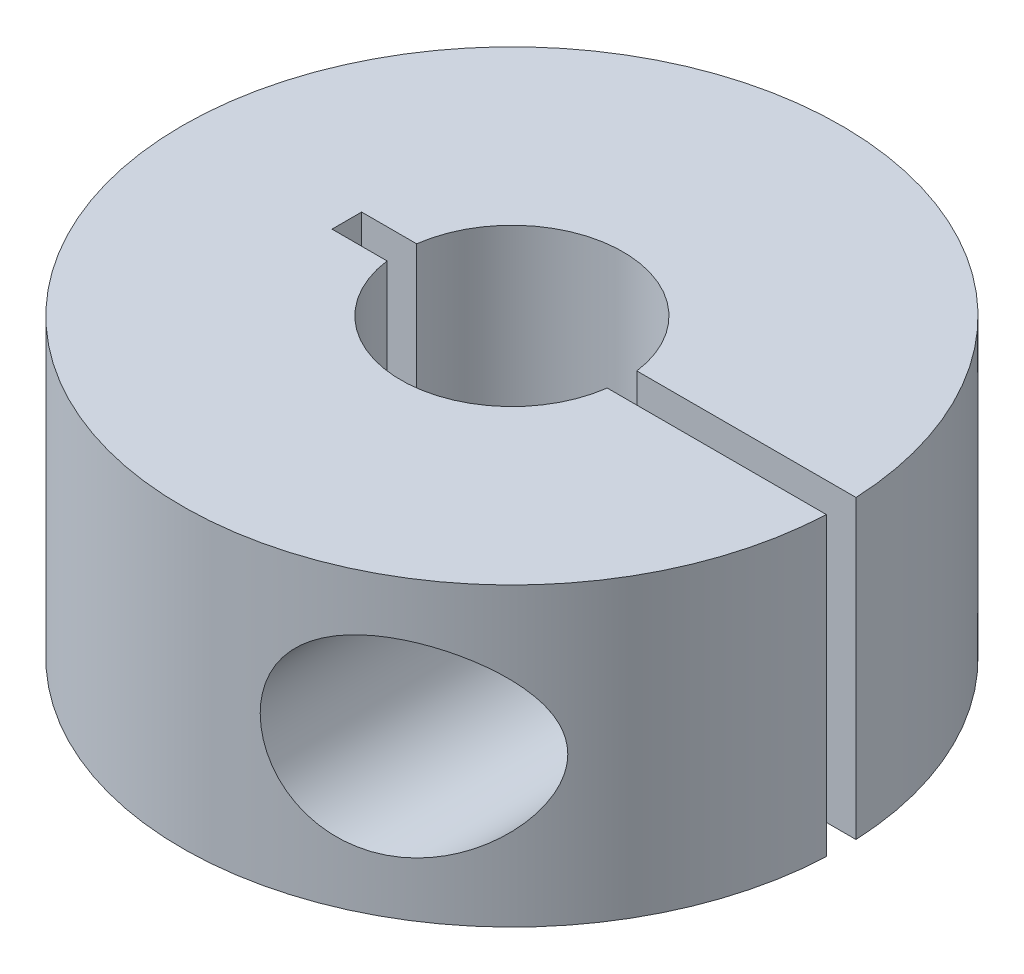
ISO-10303-21;
HEADER;
FILE_DESCRIPTION(('STEP AP214'),'2;1');
FILE_NAME('part.step','',(''),(''),'','','');
FILE_SCHEMA(('AUTOMOTIVE_DESIGN { 1 0 10303 214 1 1 1 1 }'));
ENDSEC;
DATA;
#1=APPLICATION_CONTEXT('core data for automotive mechanical design processes');
#2=APPLICATION_PROTOCOL_DEFINITION('international standard','automotive_design',2000,#1);
#3=PRODUCT_CONTEXT('',#1,'mechanical');
#4=PRODUCT('Part','Part','',(#3));
#5=PRODUCT_RELATED_PRODUCT_CATEGORY('part','',(#4));
#6=PRODUCT_DEFINITION_FORMATION('','',#4);
#7=PRODUCT_DEFINITION_CONTEXT('part definition',#1,'design');
#8=PRODUCT_DEFINITION('design','',#6,#7);
#9=PRODUCT_DEFINITION_SHAPE('','',#8);
#10=(LENGTH_UNIT() NAMED_UNIT(*) SI_UNIT(.MILLI.,.METRE.));
#11=(NAMED_UNIT(*) PLANE_ANGLE_UNIT() SI_UNIT($,.RADIAN.));
#12=(NAMED_UNIT(*) SI_UNIT($,.STERADIAN.) SOLID_ANGLE_UNIT());
#13=UNCERTAINTY_MEASURE_WITH_UNIT(LENGTH_MEASURE(1.E-05),#10,'distance_accuracy_value','');
#14=(GEOMETRIC_REPRESENTATION_CONTEXT(3) GLOBAL_UNCERTAINTY_ASSIGNED_CONTEXT((#13)) GLOBAL_UNIT_ASSIGNED_CONTEXT((#10,
#11,#12)) REPRESENTATION_CONTEXT('',''));
#15=CARTESIAN_POINT('',(0.,0.,0.));
#16=DIRECTION('',(0.,0.,1.));
#17=DIRECTION('',(1.,0.,0.));
#18=AXIS2_PLACEMENT_3D('',#15,#16,#17);
#19=CARTESIAN_POINT('',(11.4264745356653,10.,-0.500000000000002));
#20=DIRECTION('',(0.,0.,1.));
#21=DIRECTION('',(1.,0.,0.));
#22=AXIS2_PLACEMENT_3D('',#19,#20,#21);
#23=PLANE('',#22);
#24=DIRECTION('',(1.,0.,0.));
#25=VECTOR('',#24,1.);
#26=CARTESIAN_POINT('',(0.,0.,-0.500000000000001));
#27=LINE('',#26,#25);
#28=CARTESIAN_POINT('',(-5.57352546433469,0.,-0.5));
#29=VERTEX_POINT('',#28);
#30=CARTESIAN_POINT('',(-3.71651718682963,0.,-0.5));
#31=VERTEX_POINT('',#30);
#32=EDGE_CURVE('E275',#29,#31,#27,.T.);
#33=ORIENTED_EDGE('',*,*,#32,.T.);
#34=DIRECTION('',(0.,-1.,0.));
#35=VECTOR('',#34,1.);
#36=CARTESIAN_POINT('',(-3.71651718682963,10.,-0.5));
#37=LINE('',#36,#35);
#38=CARTESIAN_POINT('',(-3.71651718682963,10.,-0.5));
#39=VERTEX_POINT('',#38);
#40=EDGE_CURVE('E293',#31,#39,#37,.F.);
#41=ORIENTED_EDGE('',*,*,#40,.T.);
#42=DIRECTION('',(-1.,0.,0.));
#43=VECTOR('',#42,1.);
#44=CARTESIAN_POINT('',(11.4264745356653,10.,-0.500000000000002));
#45=LINE('',#44,#43);
#46=CARTESIAN_POINT('',(-5.57352546433469,10.,-0.5));
#47=VERTEX_POINT('',#46);
#48=EDGE_CURVE('E189',#39,#47,#45,.T.);
#49=ORIENTED_EDGE('',*,*,#48,.T.);
#50=DIRECTION('',(0.,-1.,0.));
#51=VECTOR('',#50,1.);
#52=CARTESIAN_POINT('',(-5.57352546433469,10.,-0.5));
#53=LINE('',#52,#51);
#54=EDGE_CURVE('E192',#47,#29,#53,.T.);
#55=ORIENTED_EDGE('',*,*,#54,.T.);
#56=EDGE_LOOP('',(#33,#41,#49,#55));
#57=FACE_BOUND('',#56,.T.);
#58=ADVANCED_FACE('F46',(#57),#23,.T.);
#59=CARTESIAN_POINT('',(5.5625,5.,-0.500000000000001));
#60=DIRECTION('',(0.,0.,1.));
#61=DIRECTION('',(1.,0.,0.));
#62=AXIS2_PLACEMENT_3D('',#59,#60,#61);
#63=CIRCLE('',#62,1.2);
#64=CARTESIAN_POINT('',(6.7625,5.,-0.500000000000001));
#65=VERTEX_POINT('',#64);
#66=EDGE_CURVE('E279',#65,#65,#63,.T.);
#67=ORIENTED_EDGE('',*,*,#66,.F.);
#68=EDGE_LOOP('',(#67));
#69=FACE_BOUND('',#68,.T.);
#70=CARTESIAN_POINT('',(11.1137583651976,10.,-0.500000000000002));
#71=VERTEX_POINT('',#70);
#72=CARTESIAN_POINT('',(3.71651718682963,10.,-0.500000000000001));
#73=VERTEX_POINT('',#72);
#74=EDGE_CURVE('E176',#71,#73,#45,.T.);
#75=ORIENTED_EDGE('',*,*,#74,.T.);
#76=DIRECTION('',(0.,-1.,0.));
#77=VECTOR('',#76,1.);
#78=CARTESIAN_POINT('',(3.71651718682963,10.,-0.500000000000001));
#79=LINE('',#78,#77);
#80=CARTESIAN_POINT('',(3.71651718682963,0.,-0.500000000000001));
#81=VERTEX_POINT('',#80);
#82=EDGE_CURVE('E361',#73,#81,#79,.T.);
#83=ORIENTED_EDGE('',*,*,#82,.T.);
#84=CARTESIAN_POINT('',(11.1137583651976,0.,-0.500000000000002));
#85=VERTEX_POINT('',#84);
#86=EDGE_CURVE('E274',#81,#85,#27,.T.);
#87=ORIENTED_EDGE('',*,*,#86,.T.);
#88=DIRECTION('',(0.,-1.,0.));
#89=VECTOR('',#88,1.);
#90=CARTESIAN_POINT('',(11.1137583651976,10.,-0.500000000000002));
#91=LINE('',#90,#89);
#92=EDGE_CURVE('E199',#85,#71,#91,.F.);
#93=ORIENTED_EDGE('',*,*,#92,.T.);
#94=EDGE_LOOP('',(#75,#83,#87,#93));
#95=FACE_BOUND('',#94,.T.);
#96=ADVANCED_FACE('F314',(#69,#95),#23,.T.);
#97=CARTESIAN_POINT('',(-5.57352546433469,10.,0.5));
#98=DIRECTION('',(0.,0.,-1.));
#99=DIRECTION('',(-1.,0.,0.));
#100=AXIS2_PLACEMENT_3D('',#97,#98,#99);
#101=PLANE('',#100);
#102=CARTESIAN_POINT('',(5.5625,5.,0.500000000000001));
#103=DIRECTION('',(0.,0.,-1.));
#104=DIRECTION('',(-1.,0.,0.));
#105=AXIS2_PLACEMENT_3D('',#102,#103,#104);
#106=CIRCLE('',#105,1.2);
#107=CARTESIAN_POINT('',(4.3625,5.,0.500000000000001));
#108=VERTEX_POINT('',#107);
#109=EDGE_CURVE('E184',#108,#108,#106,.T.);
#110=ORIENTED_EDGE('',*,*,#109,.F.);
#111=EDGE_LOOP('',(#110));
#112=FACE_BOUND('',#111,.T.);
#113=DIRECTION('',(1.,0.,0.));
#114=VECTOR('',#113,1.);
#115=CARTESIAN_POINT('',(-5.57352546433469,0.,0.5));
#116=LINE('',#115,#114);
#117=CARTESIAN_POINT('',(3.71651718682963,0.,0.500000000000001));
#118=VERTEX_POINT('',#117);
#119=CARTESIAN_POINT('',(11.1137583651976,0.,0.500000000000002));
#120=VERTEX_POINT('',#119);
#121=EDGE_CURVE('E162',#118,#120,#116,.T.);
#122=ORIENTED_EDGE('',*,*,#121,.F.);
#123=DIRECTION('',(0.,-1.,0.));
#124=VECTOR('',#123,1.);
#125=CARTESIAN_POINT('',(3.71651718682963,10.,0.500000000000001));
#126=LINE('',#125,#124);
#127=CARTESIAN_POINT('',(3.71651718682963,10.,0.500000000000001));
#128=VERTEX_POINT('',#127);
#129=EDGE_CURVE('E11',#118,#128,#126,.F.);
#130=ORIENTED_EDGE('',*,*,#129,.T.);
#131=DIRECTION('',(1.,0.,0.));
#132=VECTOR('',#131,1.);
#133=CARTESIAN_POINT('',(-5.57352546433469,10.,0.5));
#134=LINE('',#133,#132);
#135=CARTESIAN_POINT('',(11.1137583651976,10.,0.500000000000002));
#136=VERTEX_POINT('',#135);
#137=EDGE_CURVE('E160',#128,#136,#134,.T.);
#138=ORIENTED_EDGE('',*,*,#137,.T.);
#139=DIRECTION('',(0.,-1.,0.));
#140=VECTOR('',#139,1.);
#141=CARTESIAN_POINT('',(11.1137583651976,10.,0.500000000000002));
#142=LINE('',#141,#140);
#143=EDGE_CURVE('E196',#136,#120,#142,.T.);
#144=ORIENTED_EDGE('',*,*,#143,.T.);
#145=EDGE_LOOP('',(#122,#130,#138,#144));
#146=FACE_BOUND('',#145,.T.);
#147=ADVANCED_FACE('F158',(#112,#146),#101,.T.);
#148=CARTESIAN_POINT('',(-5.57352546433469,10.,0.5));
#149=VERTEX_POINT('',#148);
#150=CARTESIAN_POINT('',(-3.71651718682963,10.,0.5));
#151=VERTEX_POINT('',#150);
#152=EDGE_CURVE('E170',#149,#151,#134,.T.);
#153=ORIENTED_EDGE('',*,*,#152,.T.);
#154=DIRECTION('',(0.,-1.,0.));
#155=VECTOR('',#154,1.);
#156=CARTESIAN_POINT('',(-3.71651718682963,10.,0.5));
#157=LINE('',#156,#155);
#158=CARTESIAN_POINT('',(-3.71651718682963,0.,0.5));
#159=VERTEX_POINT('',#158);
#160=EDGE_CURVE('E56',#151,#159,#157,.T.);
#161=ORIENTED_EDGE('',*,*,#160,.T.);
#162=CARTESIAN_POINT('',(-5.57352546433469,0.,0.5));
#163=VERTEX_POINT('',#162);
#164=EDGE_CURVE('E185',#163,#159,#116,.T.);
#165=ORIENTED_EDGE('',*,*,#164,.F.);
#166=DIRECTION('',(0.,-1.,0.));
#167=VECTOR('',#166,1.);
#168=CARTESIAN_POINT('',(-5.57352546433469,10.,0.5));
#169=LINE('',#168,#167);
#170=EDGE_CURVE('E175',#149,#163,#169,.T.);
#171=ORIENTED_EDGE('',*,*,#170,.F.);
#172=EDGE_LOOP('',(#153,#161,#165,#171));
#173=FACE_BOUND('',#172,.T.);
#174=ADVANCED_FACE('F313',(#173),#101,.T.);
#175=CARTESIAN_POINT('',(0.,10.,0.));
#176=DIRECTION('',(0.,-1.,0.));
#177=DIRECTION('',(0.,0.,-1.));
#178=AXIS2_PLACEMENT_3D('',#175,#176,#177);
#179=CYLINDRICAL_SURFACE('',#178,11.125);
#180=CARTESIAN_POINT('',(0.,-0.492190848551153,0.));
#181=DIRECTION('',(-0.867932415787748,0.496682314588352,0.));
#182=DIRECTION('',(-0.496682314588352,-0.867932415787749,0.));
#183=AXIS2_PLACEMENT_3D('',#180,#181,#182);
#184=ELLIPSE('',#183,22.3986231706687,11.125);
#185=CARTESIAN_POINT('',(4.34203722970728,7.0953449898118,-10.2426723903401));
#186=VERTEX_POINT('',#185);
#187=CARTESIAN_POINT('',(3.13764662398417,4.99072073145928,-10.6733686651872));
#188=VERTEX_POINT('',#187);
#189=EDGE_CURVE('E266',#186,#188,#184,.T.);
#190=ORIENTED_EDGE('',*,*,#189,.T.);
#191=CARTESIAN_POINT('',(0.,10.3775725825717,0.));
#192=DIRECTION('',(-0.864105709937842,-0.503310363546012,0.));
#193=DIRECTION('',(0.503310363546012,-0.864105709937842,0.));
#194=AXIS2_PLACEMENT_3D('',#191,#192,#193);
#195=ELLIPSE('',#194,22.1036577145366,11.125);
#196=CARTESIAN_POINT('',(4.35810939427689,2.89537574164747,-10.235844249866));
#197=VERTEX_POINT('',#196);
#198=EDGE_CURVE('E270',#188,#197,#195,.T.);
#199=ORIENTED_EDGE('',*,*,#198,.T.);
#200=CARTESIAN_POINT('',(0.,2.87869841682473,0.));
#201=DIRECTION('',(0.00382670584990738,-0.999992678134364,0.));
#202=DIRECTION('',(-0.999992678134364,-0.00382670584990738,0.));
#203=AXIS2_PLACEMENT_3D('',#200,#201,#202);
#204=ELLIPSE('',#203,11.1250814563516,11.125);
#205=CARTESIAN_POINT('',(6.78296277029272,2.9046550101882,-8.81799529693813));
#206=VERTEX_POINT('',#205);
#207=EDGE_CURVE('E247',#197,#206,#204,.T.);
#208=ORIENTED_EDGE('',*,*,#207,.T.);
#209=CARTESIAN_POINT('',(0.,-8.94830027028673,0.));
#210=DIRECTION('',(0.867932415787749,-0.496682314588352,0.));
#211=DIRECTION('',(-0.496682314588352,-0.867932415787749,0.));
#212=AXIS2_PLACEMENT_3D('',#209,#210,#211);
#213=ELLIPSE('',#212,22.3986231706687,11.125);
#214=CARTESIAN_POINT('',(7.98735337601583,5.00927926854073,-7.74388862566144));
#215=VERTEX_POINT('',#214);
#216=EDGE_CURVE('E254',#206,#215,#213,.T.);
#217=ORIENTED_EDGE('',*,*,#216,.T.);
#218=CARTESIAN_POINT('',(0.,18.7223242590709,0.));
#219=DIRECTION('',(0.864105709937842,0.503310363546012,0.));
#220=DIRECTION('',(0.503310363546012,-0.864105709937842,0.));
#221=AXIS2_PLACEMENT_3D('',#218,#219,#220);
#222=ELLIPSE('',#221,22.1036577145365,11.125);
#223=CARTESIAN_POINT('',(6.76689060572311,7.10462425835253,-8.83033501800336));
#224=VERTEX_POINT('',#223);
#225=EDGE_CURVE('E258',#215,#224,#222,.T.);
#226=ORIENTED_EDGE('',*,*,#225,.T.);
#227=CARTESIAN_POINT('',(0.,7.07872916888556,0.));
#228=DIRECTION('',(-0.0038267058499072,0.999992678134364,0.));
#229=DIRECTION('',(-0.999992678134364,-0.0038267058499072,0.));
#230=AXIS2_PLACEMENT_3D('',#227,#228,#229);
#231=ELLIPSE('',#230,11.1250814563516,11.125);
#232=EDGE_CURVE('E262',#224,#186,#231,.T.);
#233=ORIENTED_EDGE('',*,*,#232,.T.);
#234=EDGE_LOOP('',(#190,#199,#208,#217,#226,#233));
#235=FACE_BOUND('',#234,.T.);
#236=ORIENTED_EDGE('',*,*,#92,.F.);
#237=CARTESIAN_POINT('',(0.,0.,0.));
#238=DIRECTION('',(0.,1.,0.));
#239=DIRECTION('',(0.,0.,1.));
#240=AXIS2_PLACEMENT_3D('',#237,#238,#239);
#241=CIRCLE('',#240,11.125);
#242=EDGE_CURVE('E230',#85,#120,#241,.T.);
#243=ORIENTED_EDGE('',*,*,#242,.T.);
#244=ORIENTED_EDGE('',*,*,#143,.F.);
#245=CARTESIAN_POINT('',(0.,10.,0.));
#246=DIRECTION('',(0.,1.,0.));
#247=DIRECTION('',(0.,0.,1.));
#248=AXIS2_PLACEMENT_3D('',#245,#246,#247);
#249=CIRCLE('',#248,11.125);
#250=EDGE_CURVE('E168',#71,#136,#249,.T.);
#251=ORIENTED_EDGE('',*,*,#250,.F.);
#252=EDGE_LOOP('',(#236,#243,#244,#251));
#253=FACE_BOUND('',#252,.T.);
#254=CARTESIAN_POINT('',(2.3725,5.,10.8690785603012));
#255=CARTESIAN_POINT('',(2.37250890376233,4.8252153984662,10.8690805979313));
#256=CARTESIAN_POINT('',(2.38692199225895,4.65026206723762,10.8659616124046));
#257=CARTESIAN_POINT('',(2.44417837292076,4.30511953915089,10.8532227450937));
#258=CARTESIAN_POINT('',(2.48706632379719,4.13493826423735,10.8435926511397));
#259=CARTESIAN_POINT('',(2.59986665364543,3.80444370719311,10.8171001563626));
#260=CARTESIAN_POINT('',(2.66976568563253,3.64412559665987,10.8002413270242));
#261=CARTESIAN_POINT('',(2.83417070365608,3.33792081072682,10.758264749748));
#262=CARTESIAN_POINT('',(2.92866653820009,3.19202821588295,10.7331504078706));
#263=CARTESIAN_POINT('',(3.13874958167743,2.91885294026048,10.6735999710828));
#264=CARTESIAN_POINT('',(3.25430362260325,2.79154155292621,10.6391784948284));
#265=CARTESIAN_POINT('',(3.50238245371645,2.55848710676125,10.5601067137221));
#266=CARTESIAN_POINT('',(3.63490748466309,2.45274435396956,10.5154562637496));
#267=CARTESIAN_POINT('',(3.91360644222134,2.26396589108013,10.414962728141));
#268=CARTESIAN_POINT('',(4.05991080903243,2.18118426004061,10.3590054004927));
#269=CARTESIAN_POINT('',(4.35985469792256,2.04074457780114,10.2363836180366));
#270=CARTESIAN_POINT('',(4.51349558428589,1.98309121974993,10.1697171662899));
#271=CARTESIAN_POINT('',(4.83197625041989,1.89010208808626,10.0224779336753));
#272=CARTESIAN_POINT('',(4.99696440486858,1.85618209328131,9.94133879920152));
#273=CARTESIAN_POINT('',(5.32518187521663,1.81453469714846,9.76946524897763));
#274=CARTESIAN_POINT('',(5.48841043912539,1.80681808383961,9.67872689704678));
#275=CARTESIAN_POINT('',(5.82905892448024,1.81605585413872,9.4779401071793));
#276=CARTESIAN_POINT('',(6.00579584305363,1.83611920924347,9.36688474200635));
#277=CARTESIAN_POINT('',(6.34912628242526,1.90355399190881,9.1376660334184));
#278=CARTESIAN_POINT('',(6.51571346353325,1.95094229759639,9.01949833728569));
#279=CARTESIAN_POINT('',(6.86313607170339,2.08035774837873,8.75885872535337));
#280=CARTESIAN_POINT('',(7.04173445860331,2.16683451931905,8.61561282294945));
#281=CARTESIAN_POINT('',(7.37962919872117,2.37071303312472,8.32802227372064));
#282=CARTESIAN_POINT('',(7.53890747201202,2.48814342156804,8.18367673003523));
#283=CARTESIAN_POINT('',(7.82103597527153,2.7400616466684,7.9139949553966));
#284=CARTESIAN_POINT('',(7.94592585780352,2.87175455159556,7.78818106560884));
#285=CARTESIAN_POINT('',(8.17514116095588,3.16041045491578,7.54719303975703));
#286=CARTESIAN_POINT('',(8.27950675018943,3.31732297857061,7.43199836023893));
#287=CARTESIAN_POINT('',(8.43087481420029,3.59844485273795,7.25908364919215));
#288=CARTESIAN_POINT('',(8.48519079036675,3.71498337706608,7.19532748290422));
#289=CARTESIAN_POINT('',(8.58082864597316,3.95935795174023,7.08099839813864));
#290=CARTESIAN_POINT('',(8.62217220878354,4.08717468731216,7.03040350507977));
#291=CARTESIAN_POINT('',(8.68309794629146,4.32875793859446,6.95495324704671));
#292=CARTESIAN_POINT('',(8.70525547341118,4.44092226642786,6.92710641205347));
#293=CARTESIAN_POINT('',(8.73744095574626,4.66963301608466,6.88646811579656));
#294=CARTESIAN_POINT('',(8.74748147899151,4.78617476790607,6.87366105531112));
#295=CARTESIAN_POINT('',(8.75459428842989,5.02068091316692,6.86460098506749));
#296=CARTESIAN_POINT('',(8.7516268135808,5.13864856778012,6.86839873048328));
#297=CARTESIAN_POINT('',(8.73291140421952,5.37191357974058,6.89217623135301));
#298=CARTESIAN_POINT('',(8.71715349114271,5.48720877989015,6.91216862116611));
#299=CARTESIAN_POINT('',(8.66982444103557,5.73449109025023,6.97147412233327));
#300=CARTESIAN_POINT('',(8.63573589757695,5.86525054404749,7.01383391174065));
#301=CARTESIAN_POINT('',(8.55374990775183,6.11626711386066,7.11358898501889));
#302=CARTESIAN_POINT('',(8.50582500703034,6.23650272401298,7.17101414097751));
#303=CARTESIAN_POINT('',(8.37401095787722,6.51842987102545,7.32501960714321));
#304=CARTESIAN_POINT('',(8.28370591242022,6.673862838907,7.42748248959108));
#305=CARTESIAN_POINT('',(8.08378174450246,6.96216843522665,7.64460589333223));
#306=CARTESIAN_POINT('',(7.97412242256766,7.09499295471206,7.75929160151915));
#307=CARTESIAN_POINT('',(7.77904668999548,7.29680758780334,7.95386812104088));
#308=CARTESIAN_POINT('',(7.69830757466445,7.37201713422979,8.03212227626242));
#309=CARTESIAN_POINT('',(7.53021407961337,7.51321674333947,8.18991915563883));
#310=CARTESIAN_POINT('',(7.44285787093854,7.57920424261886,8.26946223123869));
#311=CARTESIAN_POINT('',(7.26197044900981,7.70182115015321,8.42875695774076));
#312=CARTESIAN_POINT('',(7.16843842232729,7.75844932221885,8.50850863478437));
#313=CARTESIAN_POINT('',(6.97554762489525,7.86205984056543,8.66735113113626));
#314=CARTESIAN_POINT('',(6.8761860478022,7.90903749128605,8.74644161086344));
#315=CARTESIAN_POINT('',(6.67172581115539,7.99298743859874,8.90339080959532));
#316=CARTESIAN_POINT('',(6.56660716944123,8.02992183364402,8.98124384642071));
#317=CARTESIAN_POINT('',(6.35157592684003,8.09289568667263,9.13457922332985));
#318=CARTESIAN_POINT('',(6.24166625259523,8.11894169571961,9.21006296355422));
#319=CARTESIAN_POINT('',(6.01782792271776,8.1593799767298,9.35784759901408));
#320=CARTESIAN_POINT('',(5.90390504314976,8.17378833632786,9.4301527569687));
#321=CARTESIAN_POINT('',(5.6729099590406,8.19019337248883,9.57089601334141));
#322=CARTESIAN_POINT('',(5.55583895102154,8.19219469950845,9.63933555115525));
#323=CARTESIAN_POINT('',(5.26318354315054,8.18070820938375,9.80327903064074));
#324=CARTESIAN_POINT('',(5.08628637392154,8.15938946854441,9.89614871016448));
#325=CARTESIAN_POINT('',(4.82158818625163,8.10408019249376,10.026350112968));
#326=CARTESIAN_POINT('',(4.73343750823306,8.08174521797351,10.0682443952632));
#327=CARTESIAN_POINT('',(4.55806878433669,8.02912221959689,10.1488377594299));
#328=CARTESIAN_POINT('',(4.47085031690247,7.99883796387516,10.1875383437906));
#329=CARTESIAN_POINT('',(4.29767486030707,7.93002590143792,10.2618006828561));
#330=CARTESIAN_POINT('',(4.21172802094856,7.89145165151066,10.2973430897476));
#331=CARTESIAN_POINT('',(4.0425538905222,7.8062125769312,10.3649251819166));
#332=CARTESIAN_POINT('',(3.95932542704498,7.75955129639396,10.3969663915947));
#333=CARTESIAN_POINT('',(3.79649077523641,7.65828965154719,10.4575250919299));
#334=CARTESIAN_POINT('',(3.71688456682737,7.60368933124975,10.4860426021199));
#335=CARTESIAN_POINT('',(3.5622347998839,7.48685112678771,10.5395827451991));
#336=CARTESIAN_POINT('',(3.48719082976273,7.42461393312468,10.5646056936185));
#337=CARTESIAN_POINT('',(3.34927075900955,7.2990414283095,10.6090888754785));
#338=CARTESIAN_POINT('',(3.28591147207309,7.23634201361258,10.6288496903394));
#339=CARTESIAN_POINT('',(3.16429671400221,7.10539974490494,10.6656875048687));
#340=CARTESIAN_POINT('',(3.10604305675823,7.03715493722868,10.6827635524095));
#341=CARTESIAN_POINT('',(2.99525640572348,6.89563451956298,10.7143541244768));
#342=CARTESIAN_POINT('',(2.94272211335521,6.822360057739,10.7288692309293));
#343=CARTESIAN_POINT('',(2.84386429851645,6.6713114167039,10.7554952627516));
#344=CARTESIAN_POINT('',(2.79754292906583,6.59353569092643,10.7676053553856));
#345=CARTESIAN_POINT('',(2.67193803646557,6.36051486314437,10.7997076856757));
#346=CARTESIAN_POINT('',(2.60159523645133,6.19990204965278,10.8166851233387));
#347=CARTESIAN_POINT('',(2.48818745646895,5.86904746806178,10.8433382374425));
#348=CARTESIAN_POINT('',(2.44507827112845,5.69882179539971,10.8530257517378));
#349=CARTESIAN_POINT('',(2.40167018392266,5.4393611684423,10.8626787145714));
#350=CARTESIAN_POINT('',(2.39074291859886,5.35187666089299,10.8650830773758));
#351=CARTESIAN_POINT('',(2.3761555539314,5.17627574742842,10.8682824923919));
#352=CARTESIAN_POINT('',(2.37249550904499,5.08815933678295,10.8690775325441));
#353=CARTESIAN_POINT('',(2.3725,5.,10.8690785603012));
#354=B_SPLINE_CURVE_WITH_KNOTS('',3,(#254,#255,#256,#257,#258,#259,#260,#261,#262,#263,#264,
#265,#266,#267,#268,#269,#270,#271,#272,#273,#274,#275,#276,#277,#278,#279,#280,#281,#282,#283,
#284,#285,#286,#287,#288,#289,#290,#291,#292,#293,#294,#295,#296,#297,#298,#299,#300,#301,#302,
#303,#304,#305,#306,#307,#308,#309,#310,#311,#312,#313,#314,#315,#316,#317,#318,#319,#320,#321,
#322,#323,#324,#325,#326,#327,#328,#329,#330,#331,#332,#333,#334,#335,#336,#337,#338,#339,#340,
#341,#342,#343,#344,#345,#346,#347,#348,#349,#350,#351,#352,#353),.UNSPECIFIED.,.T.,.F.,(4,2,2,
2,2,2,2,2,2,2,2,2,2,2,2,2,2,2,2,2,2,2,2,2,2,2,2,2,2,2,2,2,2,2,2,2,2,2,2,2,2,2,2,2,2,2,2,2,2,4),
(0.,0.524029203790689,1.04888221930732,1.57347622016277,2.09785405505802,2.62141299013578,
3.14497935351453,3.67412705686134,4.20337354558159,4.76198521783097,5.32082684449288,
5.94751574642395,6.57459215803235,7.30594284488153,8.03797274047399,8.6983459285809,
9.35741353231888,9.78670581015719,10.2152766561724,10.5668394656222,10.9180373119183,
11.2703093983322,11.622856577141,12.045361455275,12.468710505837,13.0861029985883,
13.7047932597615,14.110169006475,14.515657210182,14.9211989284516,15.3269375022798,
15.7341866591906,16.1411904382947,16.5476306165792,16.9539184420126,17.5537076099621,
17.8537790673482,18.1537085403099,18.4553642818045,18.7568881563976,19.0584103594796,
19.359905319953,19.6334689111921,19.9071293014209,20.1807274271074,20.4544201215815,
20.9802213228145,21.5051668401093,21.7694791449248,22.0337934303691),.UNSPECIFIED.);
#355=CARTESIAN_POINT('',(2.3725,5.,10.8690785603012));
#356=VERTEX_POINT('',#355);
#357=EDGE_CURVE('E285',#356,#356,#354,.T.);
#358=ORIENTED_EDGE('',*,*,#357,.F.);
#359=EDGE_LOOP('',(#358));
#360=FACE_BOUND('',#359,.T.);
#361=ADVANCED_FACE('F48',(#235,#253,#360),#179,.T.);
#362=CARTESIAN_POINT('',(0.,10.,0.));
#363=DIRECTION('',(0.,1.,0.));
#364=DIRECTION('',(0.,0.,1.));
#365=AXIS2_PLACEMENT_3D('',#362,#363,#364);
#366=PLANE('',#365);
#367=ORIENTED_EDGE('',*,*,#48,.F.);
#368=CARTESIAN_POINT('',(0.,10.,0.));
#369=DIRECTION('',(0.,1.,0.));
#370=DIRECTION('',(0.,0.,1.));
#371=AXIS2_PLACEMENT_3D('',#368,#369,#370);
#372=CIRCLE('',#371,3.75);
#373=EDGE_CURVE('E154',#73,#39,#372,.T.);
#374=ORIENTED_EDGE('',*,*,#373,.F.);
#375=ORIENTED_EDGE('',*,*,#74,.F.);
#376=ORIENTED_EDGE('',*,*,#250,.T.);
#377=ORIENTED_EDGE('',*,*,#137,.F.);
#378=EDGE_CURVE('E147',#151,#128,#372,.T.);
#379=ORIENTED_EDGE('',*,*,#378,.F.);
#380=ORIENTED_EDGE('',*,*,#152,.F.);
#381=DIRECTION('',(0.,0.,1.));
#382=VECTOR('',#381,1.);
#383=CARTESIAN_POINT('',(-5.57352546433469,10.,-0.5));
#384=LINE('',#383,#382);
#385=EDGE_CURVE('E171',#47,#149,#384,.T.);
#386=ORIENTED_EDGE('',*,*,#385,.F.);
#387=EDGE_LOOP('',(#367,#374,#375,#376,#377,#379,#380,#386));
#388=FACE_BOUND('',#387,.T.);
#389=ADVANCED_FACE('F165',(#388),#366,.T.);
#390=CARTESIAN_POINT('',(0.,0.,0.));
#391=DIRECTION('',(0.,1.,0.));
#392=DIRECTION('',(0.,0.,1.));
#393=AXIS2_PLACEMENT_3D('',#390,#391,#392);
#394=PLANE('',#393);
#395=CARTESIAN_POINT('',(0.,0.,0.));
#396=DIRECTION('',(0.,1.,0.));
#397=DIRECTION('',(0.,0.,1.));
#398=AXIS2_PLACEMENT_3D('',#395,#396,#397);
#399=CIRCLE('',#398,3.75);
#400=EDGE_CURVE('E63',#31,#81,#399,.F.);
#401=ORIENTED_EDGE('',*,*,#400,.F.);
#402=ORIENTED_EDGE('',*,*,#32,.F.);
#403=DIRECTION('',(0.,0.,1.));
#404=VECTOR('',#403,1.);
#405=CARTESIAN_POINT('',(-5.57352546433469,0.,-0.5));
#406=LINE('',#405,#404);
#407=EDGE_CURVE('E180',#29,#163,#406,.T.);
#408=ORIENTED_EDGE('',*,*,#407,.T.);
#409=ORIENTED_EDGE('',*,*,#164,.T.);
#410=EDGE_CURVE('E71',#118,#159,#399,.F.);
#411=ORIENTED_EDGE('',*,*,#410,.F.);
#412=ORIENTED_EDGE('',*,*,#121,.T.);
#413=ORIENTED_EDGE('',*,*,#242,.F.);
#414=ORIENTED_EDGE('',*,*,#86,.F.);
#415=EDGE_LOOP('',(#401,#402,#408,#409,#411,#412,#413,#414));
#416=FACE_BOUND('',#415,.T.);
#417=ADVANCED_FACE('F349',(#416),#394,.F.);
#418=CARTESIAN_POINT('',(3.13764662398417,4.99072073145928,-11.125));
#419=DIRECTION('',(-0.864105709937842,-0.503310363546012,0.));
#420=DIRECTION('',(0.503310363546012,-0.864105709937842,0.));
#421=AXIS2_PLACEMENT_3D('',#418,#419,#420);
#422=PLANE('',#421);
#423=DIRECTION('',(0.,0.,1.));
#424=VECTOR('',#423,1.);
#425=CARTESIAN_POINT('',(3.13764662398417,4.99072073145928,-11.125));
#426=LINE('',#425,#424);
#427=CARTESIAN_POINT('',(3.13764662398417,4.99072073145928,-3.));
#428=VERTEX_POINT('',#427);
#429=EDGE_CURVE('E227',#188,#428,#426,.T.);
#430=ORIENTED_EDGE('',*,*,#429,.T.);
#431=DIRECTION('',(0.503310363546012,-0.864105709937842,0.));
#432=VECTOR('',#431,1.);
#433=CARTESIAN_POINT('',(3.13764662398417,4.99072073145928,-3.));
#434=LINE('',#433,#432);
#435=CARTESIAN_POINT('',(4.35810939427689,2.89537574164747,-3.));
#436=VERTEX_POINT('',#435);
#437=EDGE_CURVE('E202',#428,#436,#434,.T.);
#438=ORIENTED_EDGE('',*,*,#437,.T.);
#439=DIRECTION('',(0.,0.,1.));
#440=VECTOR('',#439,1.);
#441=CARTESIAN_POINT('',(4.35810939427689,2.89537574164747,-11.125));
#442=LINE('',#441,#440);
#443=EDGE_CURVE('E226',#197,#436,#442,.T.);
#444=ORIENTED_EDGE('',*,*,#443,.F.);
#445=ORIENTED_EDGE('',*,*,#198,.F.);
#446=EDGE_LOOP('',(#430,#438,#444,#445));
#447=FACE_BOUND('',#446,.T.);
#448=ADVANCED_FACE('F331',(#447),#422,.F.);
#449=CARTESIAN_POINT('',(4.34203722970728,7.0953449898118,-11.125));
#450=DIRECTION('',(-0.867932415787748,0.496682314588352,0.));
#451=DIRECTION('',(-0.496682314588352,-0.867932415787749,0.));
#452=AXIS2_PLACEMENT_3D('',#449,#450,#451);
#453=PLANE('',#452);
#454=DIRECTION('',(0.,0.,1.));
#455=VECTOR('',#454,1.);
#456=CARTESIAN_POINT('',(4.34203722970728,7.0953449898118,-11.125));
#457=LINE('',#456,#455);
#458=CARTESIAN_POINT('',(4.34203722970728,7.0953449898118,-3.));
#459=VERTEX_POINT('',#458);
#460=EDGE_CURVE('E231',#186,#459,#457,.T.);
#461=ORIENTED_EDGE('',*,*,#460,.T.);
#462=DIRECTION('',(-0.496682314588352,-0.867932415787748,0.));
#463=VECTOR('',#462,1.);
#464=CARTESIAN_POINT('',(4.34203722970728,7.0953449898118,-3.));
#465=LINE('',#464,#463);
#466=EDGE_CURVE('E222',#459,#428,#465,.T.);
#467=ORIENTED_EDGE('',*,*,#466,.T.);
#468=ORIENTED_EDGE('',*,*,#429,.F.);
#469=ORIENTED_EDGE('',*,*,#189,.F.);
#470=EDGE_LOOP('',(#461,#467,#468,#469));
#471=FACE_BOUND('',#470,.T.);
#472=ADVANCED_FACE('F327',(#471),#453,.F.);
#473=CARTESIAN_POINT('',(6.76689060572311,7.10462425835253,-11.125));
#474=DIRECTION('',(-0.0038267058499072,0.999992678134364,0.));
#475=DIRECTION('',(-0.999992678134364,-0.0038267058499072,0.));
#476=AXIS2_PLACEMENT_3D('',#473,#474,#475);
#477=PLANE('',#476);
#478=DIRECTION('',(0.,0.,1.));
#479=VECTOR('',#478,1.);
#480=CARTESIAN_POINT('',(6.76689060572311,7.10462425835253,-11.125));
#481=LINE('',#480,#479);
#482=CARTESIAN_POINT('',(6.76689060572311,7.10462425835253,-3.));
#483=VERTEX_POINT('',#482);
#484=EDGE_CURVE('E234',#224,#483,#481,.T.);
#485=ORIENTED_EDGE('',*,*,#484,.T.);
#486=DIRECTION('',(-0.999992678134364,-0.0038267058499072,0.));
#487=VECTOR('',#486,1.);
#488=CARTESIAN_POINT('',(6.76689060572311,7.10462425835253,-3.));
#489=LINE('',#488,#487);
#490=EDGE_CURVE('E218',#483,#459,#489,.T.);
#491=ORIENTED_EDGE('',*,*,#490,.T.);
#492=ORIENTED_EDGE('',*,*,#460,.F.);
#493=ORIENTED_EDGE('',*,*,#232,.F.);
#494=EDGE_LOOP('',(#485,#491,#492,#493));
#495=FACE_BOUND('',#494,.T.);
#496=ADVANCED_FACE('F330',(#495),#477,.F.);
#497=CARTESIAN_POINT('',(7.98735337601583,5.00927926854073,-11.125));
#498=DIRECTION('',(0.864105709937842,0.503310363546012,0.));
#499=DIRECTION('',(-0.503310363546012,0.864105709937842,0.));
#500=AXIS2_PLACEMENT_3D('',#497,#498,#499);
#501=PLANE('',#500);
#502=DIRECTION('',(0.,0.,1.));
#503=VECTOR('',#502,1.);
#504=CARTESIAN_POINT('',(7.98735337601583,5.00927926854073,-11.125));
#505=LINE('',#504,#503);
#506=CARTESIAN_POINT('',(7.98735337601583,5.00927926854073,-3.));
#507=VERTEX_POINT('',#506);
#508=EDGE_CURVE('E237',#215,#507,#505,.T.);
#509=ORIENTED_EDGE('',*,*,#508,.T.);
#510=DIRECTION('',(-0.503310363546012,0.864105709937842,0.));
#511=VECTOR('',#510,1.);
#512=CARTESIAN_POINT('',(7.98735337601583,5.00927926854073,-3.));
#513=LINE('',#512,#511);
#514=EDGE_CURVE('E214',#507,#483,#513,.T.);
#515=ORIENTED_EDGE('',*,*,#514,.T.);
#516=ORIENTED_EDGE('',*,*,#484,.F.);
#517=ORIENTED_EDGE('',*,*,#225,.F.);
#518=EDGE_LOOP('',(#509,#515,#516,#517));
#519=FACE_BOUND('',#518,.T.);
#520=ADVANCED_FACE('F335',(#519),#501,.F.);
#521=CARTESIAN_POINT('',(6.78296277029272,2.9046550101882,-11.125));
#522=DIRECTION('',(0.867932415787749,-0.496682314588352,0.));
#523=DIRECTION('',(0.496682314588352,0.867932415787749,0.));
#524=AXIS2_PLACEMENT_3D('',#521,#522,#523);
#525=PLANE('',#524);
#526=DIRECTION('',(0.,0.,1.));
#527=VECTOR('',#526,1.);
#528=CARTESIAN_POINT('',(6.78296277029272,2.9046550101882,-11.125));
#529=LINE('',#528,#527);
#530=CARTESIAN_POINT('',(6.78296277029272,2.9046550101882,-3.));
#531=VERTEX_POINT('',#530);
#532=EDGE_CURVE('E240',#206,#531,#529,.T.);
#533=ORIENTED_EDGE('',*,*,#532,.T.);
#534=DIRECTION('',(0.496682314588352,0.867932415787749,0.));
#535=VECTOR('',#534,1.);
#536=CARTESIAN_POINT('',(6.78296277029272,2.9046550101882,-3.));
#537=LINE('',#536,#535);
#538=EDGE_CURVE('E210',#531,#507,#537,.T.);
#539=ORIENTED_EDGE('',*,*,#538,.T.);
#540=ORIENTED_EDGE('',*,*,#508,.F.);
#541=ORIENTED_EDGE('',*,*,#216,.F.);
#542=EDGE_LOOP('',(#533,#539,#540,#541));
#543=FACE_BOUND('',#542,.T.);
#544=ADVANCED_FACE('F339',(#543),#525,.F.);
#545=CARTESIAN_POINT('',(4.35810939427689,2.89537574164747,-11.125));
#546=DIRECTION('',(0.00382670584990738,-0.999992678134364,0.));
#547=DIRECTION('',(0.999992678134364,0.00382670584990738,0.));
#548=AXIS2_PLACEMENT_3D('',#545,#546,#547);
#549=PLANE('',#548);
#550=ORIENTED_EDGE('',*,*,#443,.T.);
#551=DIRECTION('',(0.999992678134364,0.00382670584990738,0.));
#552=VECTOR('',#551,1.);
#553=CARTESIAN_POINT('',(4.35810939427689,2.89537574164747,-3.));
#554=LINE('',#553,#552);
#555=EDGE_CURVE('E206',#436,#531,#554,.T.);
#556=ORIENTED_EDGE('',*,*,#555,.T.);
#557=ORIENTED_EDGE('',*,*,#532,.F.);
#558=ORIENTED_EDGE('',*,*,#207,.F.);
#559=EDGE_LOOP('',(#550,#556,#557,#558));
#560=FACE_BOUND('',#559,.T.);
#561=ADVANCED_FACE('F325',(#560),#549,.F.);
#562=CARTESIAN_POINT('',(0.,0.,-3.));
#563=DIRECTION('',(0.,0.,1.));
#564=DIRECTION('',(1.,0.,0.));
#565=AXIS2_PLACEMENT_3D('',#562,#563,#564);
#566=PLANE('',#565);
#567=CARTESIAN_POINT('',(5.5625,5.,-3.));
#568=DIRECTION('',(0.,0.,1.));
#569=DIRECTION('',(1.,0.,0.));
#570=AXIS2_PLACEMENT_3D('',#567,#568,#569);
#571=CIRCLE('',#570,1.2);
#572=CARTESIAN_POINT('',(6.7625,5.,-3.));
#573=VERTEX_POINT('',#572);
#574=EDGE_CURVE('E283',#573,#573,#571,.T.);
#575=ORIENTED_EDGE('',*,*,#574,.T.);
#576=EDGE_LOOP('',(#575));
#577=FACE_BOUND('',#576,.T.);
#578=ORIENTED_EDGE('',*,*,#437,.F.);
#579=ORIENTED_EDGE('',*,*,#466,.F.);
#580=ORIENTED_EDGE('',*,*,#490,.F.);
#581=ORIENTED_EDGE('',*,*,#514,.F.);
#582=ORIENTED_EDGE('',*,*,#538,.F.);
#583=ORIENTED_EDGE('',*,*,#555,.F.);
#584=EDGE_LOOP('',(#578,#579,#580,#581,#582,#583));
#585=FACE_BOUND('',#584,.T.);
#586=ADVANCED_FACE('F318',(#577,#585),#566,.F.);
#587=CARTESIAN_POINT('',(-5.57352546433469,10.,-0.5));
#588=DIRECTION('',(1.,0.,0.));
#589=DIRECTION('',(0.,0.,-1.));
#590=AXIS2_PLACEMENT_3D('',#587,#588,#589);
#591=PLANE('',#590);
#592=ORIENTED_EDGE('',*,*,#407,.F.);
#593=ORIENTED_EDGE('',*,*,#54,.F.);
#594=ORIENTED_EDGE('',*,*,#385,.T.);
#595=ORIENTED_EDGE('',*,*,#170,.T.);
#596=EDGE_LOOP('',(#592,#593,#594,#595));
#597=FACE_BOUND('',#596,.T.);
#598=ADVANCED_FACE('F309',(#597),#591,.T.);
#599=CARTESIAN_POINT('',(5.5625,5.,4.6));
#600=DIRECTION('',(0.,0.,1.));
#601=DIRECTION('',(1.,0.,0.));
#602=AXIS2_PLACEMENT_3D('',#599,#600,#601);
#603=CYLINDRICAL_SURFACE('',#602,1.2);
#604=ORIENTED_EDGE('',*,*,#66,.T.);
#605=EDGE_LOOP('',(#604));
#606=FACE_BOUND('',#605,.T.);
#607=ORIENTED_EDGE('',*,*,#574,.F.);
#608=EDGE_LOOP('',(#607));
#609=FACE_BOUND('',#608,.T.);
#610=ADVANCED_FACE('F306',(#606,#609),#603,.F.);
#611=ORIENTED_EDGE('',*,*,#109,.T.);
#612=EDGE_LOOP('',(#611));
#613=FACE_BOUND('',#612,.T.);
#614=CARTESIAN_POINT('',(5.5625,5.,3.));
#615=DIRECTION('',(0.,0.,1.));
#616=DIRECTION('',(1.,0.,0.));
#617=AXIS2_PLACEMENT_3D('',#614,#615,#616);
#618=CIRCLE('',#617,1.2);
#619=CARTESIAN_POINT('',(6.7625,5.,3.));
#620=VERTEX_POINT('',#619);
#621=EDGE_CURVE('E284',#620,#620,#618,.T.);
#622=ORIENTED_EDGE('',*,*,#621,.T.);
#623=EDGE_LOOP('',(#622));
#624=FACE_BOUND('',#623,.T.);
#625=ADVANCED_FACE('F304',(#613,#624),#603,.F.);
#626=CARTESIAN_POINT('',(6.7625,5.,3.));
#627=DIRECTION('',(0.,0.,-1.));
#628=DIRECTION('',(-1.,0.,0.));
#629=AXIS2_PLACEMENT_3D('',#626,#627,#628);
#630=PLANE('',#629);
#631=ORIENTED_EDGE('',*,*,#621,.F.);
#632=EDGE_LOOP('',(#631));
#633=FACE_BOUND('',#632,.T.);
#634=CARTESIAN_POINT('',(5.5625,5.,3.));
#635=DIRECTION('',(0.,0.,1.));
#636=DIRECTION('',(1.,0.,0.));
#637=AXIS2_PLACEMENT_3D('',#634,#635,#636);
#638=CIRCLE('',#637,3.19);
#639=CARTESIAN_POINT('',(8.7525,5.,3.));
#640=VERTEX_POINT('',#639);
#641=EDGE_CURVE('E292',#640,#640,#638,.T.);
#642=ORIENTED_EDGE('',*,*,#641,.T.);
#643=EDGE_LOOP('',(#642));
#644=FACE_BOUND('',#643,.T.);
#645=ADVANCED_FACE('F300',(#633,#644),#630,.F.);
#646=CARTESIAN_POINT('',(5.5625,5.,4.6));
#647=DIRECTION('',(0.,0.,1.));
#648=DIRECTION('',(1.,0.,0.));
#649=AXIS2_PLACEMENT_3D('',#646,#647,#648);
#650=CYLINDRICAL_SURFACE('',#649,3.19);
#651=ORIENTED_EDGE('',*,*,#641,.F.);
#652=EDGE_LOOP('',(#651));
#653=FACE_BOUND('',#652,.T.);
#654=ORIENTED_EDGE('',*,*,#357,.T.);
#655=EDGE_LOOP('',(#654));
#656=FACE_BOUND('',#655,.T.);
#657=ADVANCED_FACE('F297',(#653,#656),#650,.F.);
#658=CARTESIAN_POINT('',(0.,10.,0.));
#659=DIRECTION('',(0.,-1.,0.));
#660=DIRECTION('',(0.,0.,-1.));
#661=AXIS2_PLACEMENT_3D('',#658,#659,#660);
#662=CYLINDRICAL_SURFACE('',#661,3.75);
#663=ORIENTED_EDGE('',*,*,#410,.T.);
#664=ORIENTED_EDGE('',*,*,#160,.F.);
#665=ORIENTED_EDGE('',*,*,#378,.T.);
#666=ORIENTED_EDGE('',*,*,#129,.F.);
#667=EDGE_LOOP('',(#663,#664,#665,#666));
#668=FACE_BOUND('',#667,.T.);
#669=ADVANCED_FACE('F148',(#668),#662,.F.);
#670=ORIENTED_EDGE('',*,*,#400,.T.);
#671=ORIENTED_EDGE('',*,*,#82,.F.);
#672=ORIENTED_EDGE('',*,*,#373,.T.);
#673=ORIENTED_EDGE('',*,*,#40,.F.);
#674=EDGE_LOOP('',(#670,#671,#672,#673));
#675=FACE_BOUND('',#674,.T.);
#676=ADVANCED_FACE('F489',(#675),#662,.F.);
#677=CLOSED_SHELL('',(#58,#96,#147,#174,#361,#389,#417,#448,#472,#496,#520,#544,#561,#586,#598,
#610,#625,#645,#657,#669,#676));
#678=MANIFOLD_SOLID_BREP('B2',#677);
#679=ADVANCED_BREP_SHAPE_REPRESENTATION('',(#18,#678),#14);
#680=SHAPE_DEFINITION_REPRESENTATION(#9,#679);
ENDSEC;
END-ISO-10303-21;
